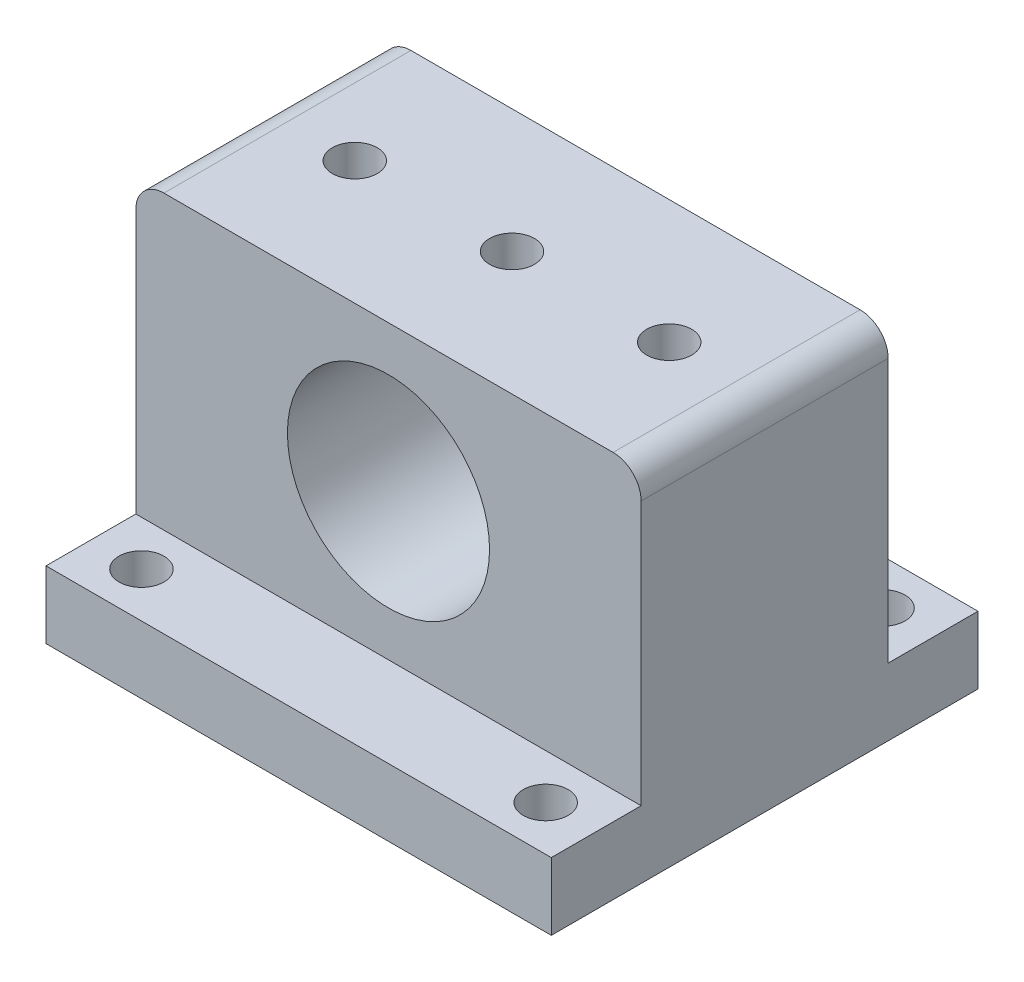
ISO-10303-21;
HEADER;
FILE_DESCRIPTION(('STEP AP214'),'2;1');
FILE_NAME('part.step','',(''),(''),'','','');
FILE_SCHEMA(('AUTOMOTIVE_DESIGN { 1 0 10303 214 1 1 1 1 }'));
ENDSEC;
DATA;
#1=APPLICATION_CONTEXT('core data for automotive mechanical design processes');
#2=APPLICATION_PROTOCOL_DEFINITION('international standard','automotive_design',2000,#1);
#3=PRODUCT_CONTEXT('',#1,'mechanical');
#4=PRODUCT('Part','Part','',(#3));
#5=PRODUCT_RELATED_PRODUCT_CATEGORY('part','',(#4));
#6=PRODUCT_DEFINITION_FORMATION('','',#4);
#7=PRODUCT_DEFINITION_CONTEXT('part definition',#1,'design');
#8=PRODUCT_DEFINITION('design','',#6,#7);
#9=PRODUCT_DEFINITION_SHAPE('','',#8);
#10=(LENGTH_UNIT() NAMED_UNIT(*) SI_UNIT(.MILLI.,.METRE.));
#11=(NAMED_UNIT(*) PLANE_ANGLE_UNIT() SI_UNIT($,.RADIAN.));
#12=(NAMED_UNIT(*) SI_UNIT($,.STERADIAN.) SOLID_ANGLE_UNIT());
#13=UNCERTAINTY_MEASURE_WITH_UNIT(LENGTH_MEASURE(1.E-05),#10,'distance_accuracy_value','');
#14=(GEOMETRIC_REPRESENTATION_CONTEXT(3) GLOBAL_UNCERTAINTY_ASSIGNED_CONTEXT((#13)) GLOBAL_UNIT_ASSIGNED_CONTEXT((#10,
#11,#12)) REPRESENTATION_CONTEXT('',''));
#15=CARTESIAN_POINT('',(0.,0.,0.));
#16=DIRECTION('',(0.,0.,1.));
#17=DIRECTION('',(1.,0.,0.));
#18=AXIS2_PLACEMENT_3D('',#15,#16,#17);
#19=CARTESIAN_POINT('',(0.,13.,11.));
#20=DIRECTION('',(0.,1.,0.));
#21=DIRECTION('',(0.,0.,1.));
#22=AXIS2_PLACEMENT_3D('',#19,#20,#21);
#23=PLANE('',#22);
#24=CARTESIAN_POINT('',(14.,13.,0.));
#25=DIRECTION('',(0.,-1.,0.));
#26=DIRECTION('',(0.,0.,1.));
#27=AXIS2_PLACEMENT_3D('',#24,#25,#26);
#28=CIRCLE('',#27,2.);
#29=CARTESIAN_POINT('',(14.,13.,2.));
#30=VERTEX_POINT('',#29);
#31=EDGE_CURVE('E358',#30,#30,#28,.T.);
#32=ORIENTED_EDGE('',*,*,#31,.T.);
#33=EDGE_LOOP('',(#32));
#34=FACE_BOUND('',#33,.T.);
#35=CARTESIAN_POINT('',(-14.,13.,0.));
#36=DIRECTION('',(0.,1.,0.));
#37=DIRECTION('',(0.,0.,1.));
#38=AXIS2_PLACEMENT_3D('',#35,#36,#37);
#39=CIRCLE('',#38,2.);
#40=CARTESIAN_POINT('',(-14.,13.,2.));
#41=VERTEX_POINT('',#40);
#42=EDGE_CURVE('E226',#41,#41,#39,.T.);
#43=ORIENTED_EDGE('',*,*,#42,.F.);
#44=EDGE_LOOP('',(#43));
#45=FACE_BOUND('',#44,.T.);
#46=CARTESIAN_POINT('',(0.,13.,0.));
#47=DIRECTION('',(0.,1.,0.));
#48=DIRECTION('',(0.,0.,1.));
#49=AXIS2_PLACEMENT_3D('',#46,#47,#48);
#50=CIRCLE('',#49,2.);
#51=CARTESIAN_POINT('',(0.,13.,2.));
#52=VERTEX_POINT('',#51);
#53=EDGE_CURVE('E224',#52,#52,#50,.T.);
#54=ORIENTED_EDGE('',*,*,#53,.F.);
#55=EDGE_LOOP('',(#54));
#56=FACE_BOUND('',#55,.T.);
#57=DIRECTION('',(1.,0.,0.));
#58=VECTOR('',#57,1.);
#59=CARTESIAN_POINT('',(0.,13.,-11.));
#60=LINE('',#59,#58);
#61=CARTESIAN_POINT('',(-20.,13.,-11.));
#62=VERTEX_POINT('',#61);
#63=CARTESIAN_POINT('',(20.,13.,-11.));
#64=VERTEX_POINT('',#63);
#65=EDGE_CURVE('E126',#62,#64,#60,.T.);
#66=ORIENTED_EDGE('',*,*,#65,.F.);
#67=DIRECTION('',(0.,0.,-1.));
#68=VECTOR('',#67,1.);
#69=CARTESIAN_POINT('',(-20.,13.,11.));
#70=LINE('',#69,#68);
#71=CARTESIAN_POINT('',(-20.,13.,11.));
#72=VERTEX_POINT('',#71);
#73=EDGE_CURVE('E11',#72,#62,#70,.T.);
#74=ORIENTED_EDGE('',*,*,#73,.F.);
#75=DIRECTION('',(1.,0.,0.));
#76=VECTOR('',#75,1.);
#77=CARTESIAN_POINT('',(0.,13.,11.));
#78=LINE('',#77,#76);
#79=CARTESIAN_POINT('',(20.,13.,11.));
#80=VERTEX_POINT('',#79);
#81=EDGE_CURVE('E286',#72,#80,#78,.T.);
#82=ORIENTED_EDGE('',*,*,#81,.T.);
#83=DIRECTION('',(0.,0.,-1.));
#84=VECTOR('',#83,1.);
#85=CARTESIAN_POINT('',(20.,13.,11.));
#86=LINE('',#85,#84);
#87=EDGE_CURVE('E58',#80,#64,#86,.T.);
#88=ORIENTED_EDGE('',*,*,#87,.T.);
#89=EDGE_LOOP('',(#66,#74,#82,#88));
#90=FACE_BOUND('',#89,.T.);
#91=ADVANCED_FACE('F41',(#34,#45,#56,#90),#23,.T.);
#92=CARTESIAN_POINT('',(-20.,10.5,11.));
#93=DIRECTION('',(0.,0.,-1.));
#94=DIRECTION('',(-1.,0.,0.));
#95=AXIS2_PLACEMENT_3D('',#92,#93,#94);
#96=CYLINDRICAL_SURFACE('',#95,2.5);
#97=CARTESIAN_POINT('',(-20.,10.5,-11.));
#98=DIRECTION('',(0.,0.,1.));
#99=DIRECTION('',(1.,0.,0.));
#100=AXIS2_PLACEMENT_3D('',#97,#98,#99);
#101=CIRCLE('',#100,2.5);
#102=CARTESIAN_POINT('',(-22.5,10.5,-11.));
#103=VERTEX_POINT('',#102);
#104=EDGE_CURVE('E128',#62,#103,#101,.T.);
#105=ORIENTED_EDGE('',*,*,#104,.T.);
#106=DIRECTION('',(0.,0.,-1.));
#107=VECTOR('',#106,1.);
#108=CARTESIAN_POINT('',(-22.5,10.5,11.));
#109=LINE('',#108,#107);
#110=CARTESIAN_POINT('',(-22.5,10.5,11.));
#111=VERTEX_POINT('',#110);
#112=EDGE_CURVE('E50',#111,#103,#109,.T.);
#113=ORIENTED_EDGE('',*,*,#112,.F.);
#114=CARTESIAN_POINT('',(-20.,10.5,11.));
#115=DIRECTION('',(0.,0.,1.));
#116=DIRECTION('',(1.,0.,0.));
#117=AXIS2_PLACEMENT_3D('',#114,#115,#116);
#118=CIRCLE('',#117,2.5);
#119=EDGE_CURVE('E288',#72,#111,#118,.T.);
#120=ORIENTED_EDGE('',*,*,#119,.F.);
#121=ORIENTED_EDGE('',*,*,#73,.T.);
#122=EDGE_LOOP('',(#105,#113,#120,#121));
#123=FACE_BOUND('',#122,.T.);
#124=ADVANCED_FACE('F153',(#123),#96,.T.);
#125=CARTESIAN_POINT('',(-22.5,0.,11.));
#126=DIRECTION('',(1.,0.,0.));
#127=DIRECTION('',(0.,1.,0.));
#128=AXIS2_PLACEMENT_3D('',#125,#126,#127);
#129=PLANE('',#128);
#130=DIRECTION('',(0.,-1.,0.));
#131=VECTOR('',#130,1.);
#132=CARTESIAN_POINT('',(-22.5,0.,-11.));
#133=LINE('',#132,#131);
#134=CARTESIAN_POINT('',(-22.5,-13.,-11.));
#135=VERTEX_POINT('',#134);
#136=EDGE_CURVE('E131',#103,#135,#133,.T.);
#137=ORIENTED_EDGE('',*,*,#136,.T.);
#138=DIRECTION('',(0.,0.,-1.));
#139=VECTOR('',#138,1.);
#140=CARTESIAN_POINT('',(-22.5,-13.,19.));
#141=LINE('',#140,#139);
#142=CARTESIAN_POINT('',(-22.5,-13.,-19.));
#143=VERTEX_POINT('',#142);
#144=EDGE_CURVE('E279',#135,#143,#141,.T.);
#145=ORIENTED_EDGE('',*,*,#144,.T.);
#146=DIRECTION('',(0.,1.,0.));
#147=VECTOR('',#146,1.);
#148=CARTESIAN_POINT('',(-22.5,0.,-19.));
#149=LINE('',#148,#147);
#150=CARTESIAN_POINT('',(-22.5,-19.,-19.));
#151=VERTEX_POINT('',#150);
#152=EDGE_CURVE('E259',#151,#143,#149,.T.);
#153=ORIENTED_EDGE('',*,*,#152,.F.);
#154=DIRECTION('',(0.,0.,-1.));
#155=VECTOR('',#154,1.);
#156=CARTESIAN_POINT('',(-22.5,-19.,19.));
#157=LINE('',#156,#155);
#158=CARTESIAN_POINT('',(-22.5,-19.,19.));
#159=VERTEX_POINT('',#158);
#160=EDGE_CURVE('E266',#159,#151,#157,.T.);
#161=ORIENTED_EDGE('',*,*,#160,.F.);
#162=DIRECTION('',(0.,1.,0.));
#163=VECTOR('',#162,1.);
#164=CARTESIAN_POINT('',(-22.5,0.,19.));
#165=LINE('',#164,#163);
#166=CARTESIAN_POINT('',(-22.5,-13.,19.));
#167=VERTEX_POINT('',#166);
#168=EDGE_CURVE('E263',#159,#167,#165,.T.);
#169=ORIENTED_EDGE('',*,*,#168,.T.);
#170=CARTESIAN_POINT('',(-22.5,-13.,11.));
#171=VERTEX_POINT('',#170);
#172=EDGE_CURVE('E280',#167,#171,#141,.T.);
#173=ORIENTED_EDGE('',*,*,#172,.T.);
#174=DIRECTION('',(0.,-1.,0.));
#175=VECTOR('',#174,1.);
#176=CARTESIAN_POINT('',(-22.5,0.,11.));
#177=LINE('',#176,#175);
#178=EDGE_CURVE('E115',#111,#171,#177,.T.);
#179=ORIENTED_EDGE('',*,*,#178,.F.);
#180=ORIENTED_EDGE('',*,*,#112,.T.);
#181=EDGE_LOOP('',(#137,#145,#153,#161,#169,#173,#179,#180));
#182=FACE_BOUND('',#181,.T.);
#183=ADVANCED_FACE('F148',(#182),#129,.F.);
#184=CARTESIAN_POINT('',(22.5,0.,11.));
#185=DIRECTION('',(1.,0.,0.));
#186=DIRECTION('',(0.,1.,0.));
#187=AXIS2_PLACEMENT_3D('',#184,#185,#186);
#188=PLANE('',#187);
#189=DIRECTION('',(0.,-1.,0.));
#190=VECTOR('',#189,1.);
#191=CARTESIAN_POINT('',(22.5,0.,-11.));
#192=LINE('',#191,#190);
#193=CARTESIAN_POINT('',(22.5,10.5,-11.));
#194=VERTEX_POINT('',#193);
#195=CARTESIAN_POINT('',(22.5,-13.,-11.));
#196=VERTEX_POINT('',#195);
#197=EDGE_CURVE('E137',#194,#196,#192,.T.);
#198=ORIENTED_EDGE('',*,*,#197,.F.);
#199=DIRECTION('',(0.,0.,-1.));
#200=VECTOR('',#199,1.);
#201=CARTESIAN_POINT('',(22.5,10.5,11.));
#202=LINE('',#201,#200);
#203=CARTESIAN_POINT('',(22.5,10.5,11.));
#204=VERTEX_POINT('',#203);
#205=EDGE_CURVE('E72',#204,#194,#202,.T.);
#206=ORIENTED_EDGE('',*,*,#205,.F.);
#207=DIRECTION('',(0.,-1.,0.));
#208=VECTOR('',#207,1.);
#209=CARTESIAN_POINT('',(22.5,0.,11.));
#210=LINE('',#209,#208);
#211=CARTESIAN_POINT('',(22.5,-13.,11.));
#212=VERTEX_POINT('',#211);
#213=EDGE_CURVE('E113',#204,#212,#210,.T.);
#214=ORIENTED_EDGE('',*,*,#213,.T.);
#215=DIRECTION('',(0.,0.,-1.));
#216=VECTOR('',#215,1.);
#217=CARTESIAN_POINT('',(22.5,-13.,19.));
#218=LINE('',#217,#216);
#219=CARTESIAN_POINT('',(22.5,-13.,19.));
#220=VERTEX_POINT('',#219);
#221=EDGE_CURVE('E91',#220,#212,#218,.T.);
#222=ORIENTED_EDGE('',*,*,#221,.F.);
#223=DIRECTION('',(0.,1.,0.));
#224=VECTOR('',#223,1.);
#225=CARTESIAN_POINT('',(22.5,0.,19.));
#226=LINE('',#225,#224);
#227=CARTESIAN_POINT('',(22.5,-19.,19.));
#228=VERTEX_POINT('',#227);
#229=EDGE_CURVE('E258',#228,#220,#226,.T.);
#230=ORIENTED_EDGE('',*,*,#229,.F.);
#231=DIRECTION('',(0.,0.,-1.));
#232=VECTOR('',#231,1.);
#233=CARTESIAN_POINT('',(22.5,-19.,19.));
#234=LINE('',#233,#232);
#235=CARTESIAN_POINT('',(22.5,-19.,-19.));
#236=VERTEX_POINT('',#235);
#237=EDGE_CURVE('E104',#228,#236,#234,.T.);
#238=ORIENTED_EDGE('',*,*,#237,.T.);
#239=DIRECTION('',(0.,1.,0.));
#240=VECTOR('',#239,1.);
#241=CARTESIAN_POINT('',(22.5,0.,-19.));
#242=LINE('',#241,#240);
#243=CARTESIAN_POINT('',(22.5,-13.,-19.));
#244=VERTEX_POINT('',#243);
#245=EDGE_CURVE('E269',#236,#244,#242,.T.);
#246=ORIENTED_EDGE('',*,*,#245,.T.);
#247=EDGE_CURVE('E105',#196,#244,#218,.T.);
#248=ORIENTED_EDGE('',*,*,#247,.F.);
#249=EDGE_LOOP('',(#198,#206,#214,#222,#230,#238,#246,#248));
#250=FACE_BOUND('',#249,.T.);
#251=ADVANCED_FACE('F117',(#250),#188,.T.);
#252=CARTESIAN_POINT('',(0.,0.,11.));
#253=DIRECTION('',(0.,0.,-1.));
#254=DIRECTION('',(-1.,0.,0.));
#255=AXIS2_PLACEMENT_3D('',#252,#253,#254);
#256=CYLINDRICAL_SURFACE('',#255,9.);
#257=CARTESIAN_POINT('',(0.,9.,2.));
#258=CARTESIAN_POINT('',(0.110880476775648,8.99999796218252,1.99999627632018));
#259=CARTESIAN_POINT('',(0.22180556526962,8.99793013995692,1.99074801833651));
#260=CARTESIAN_POINT('',(0.440501944103134,8.98988097757669,1.95403952764944));
#261=CARTESIAN_POINT('',(0.548270975138988,8.98389690217348,1.92656656599072));
#262=CARTESIAN_POINT('',(0.757463277761529,8.96868113169008,1.85431402950835));
#263=CARTESIAN_POINT('',(0.858893152100285,8.95945288439082,1.80955282300213));
#264=CARTESIAN_POINT('',(1.05280018031376,8.93874335441377,1.7040533875276));
#265=CARTESIAN_POINT('',(1.14527750793335,8.92726211547358,1.64331546870938));
#266=CARTESIAN_POINT('',(1.32018631401403,8.9030909417421,1.50652433489332));
#267=CARTESIAN_POINT('',(1.40244861204353,8.89038561641427,1.43025749786486));
#268=CARTESIAN_POINT('',(1.55312491045837,8.86530601079787,1.26503193990686));
#269=CARTESIAN_POINT('',(1.62153764410855,8.85293176088049,1.17607205928954));
#270=CARTESIAN_POINT('',(1.7433244341035,8.82976328261711,0.9867281559417));
#271=CARTESIAN_POINT('',(1.79651742104404,8.81898875742981,0.886225041958469));
#272=CARTESIAN_POINT('',(1.88519298954508,8.80046096352395,0.677427238307578));
#273=CARTESIAN_POINT('',(1.92067776220096,8.79270732104771,0.569133514495745));
#274=CARTESIAN_POINT('',(1.97236858006404,8.78125609459188,0.349666522677334));
#275=CARTESIAN_POINT('',(1.98887467038069,8.77749545807783,0.238567284894573));
#276=CARTESIAN_POINT('',(2.00307270997673,8.77426673730669,0.0151177822137991));
#277=CARTESIAN_POINT('',(2.00076704911663,8.77479810778939,-0.0972323219621479));
#278=CARTESIAN_POINT('',(1.97764827517302,8.78003632148145,-0.317756627193803));
#279=CARTESIAN_POINT('',(1.95718464460217,8.78466431384841,-0.425969624139346));
#280=CARTESIAN_POINT('',(1.89888490681146,8.79744954191675,-0.637387143325003));
#281=CARTESIAN_POINT('',(1.86104779681652,8.80560698133176,-0.7405913760854));
#282=CARTESIAN_POINT('',(1.76875672872875,8.82460909970296,-0.940039438381882));
#283=CARTESIAN_POINT('',(1.71416919379353,8.83547524362489,-1.03621932733607));
#284=CARTESIAN_POINT('',(1.5900206813985,8.85865737910743,-1.21818287051589));
#285=CARTESIAN_POINT('',(1.52045760074274,8.87097357420597,-1.30396506182015));
#286=CARTESIAN_POINT('',(1.36648683702983,8.89600574612666,-1.46470930934847));
#287=CARTESIAN_POINT('',(1.28178220526623,8.90872450687872,-1.53938678510506));
#288=CARTESIAN_POINT('',(1.10090661809162,8.93287839122317,-1.67352372890712));
#289=CARTESIAN_POINT('',(1.00473544183737,8.94431349008427,-1.7329829037819));
#290=CARTESIAN_POINT('',(0.803303190734734,8.96465064233607,-1.83506927577681));
#291=CARTESIAN_POINT('',(0.698022122319853,8.97354693007659,-1.87765824430826));
#292=CARTESIAN_POINT('',(0.481555930981456,8.98776136366255,-1.94446101305787));
#293=CARTESIAN_POINT('',(0.370371697593365,8.99308004696785,-1.96867757341413));
#294=CARTESIAN_POINT('',(0.147695483280844,8.99946317761672,-1.99763201325517));
#295=CARTESIAN_POINT('',(0.0362563973189045,9.00061248622289,-2.00275850016168));
#296=CARTESIAN_POINT('',(-0.18588592392808,8.99876558650597,-1.99444189573963));
#297=CARTESIAN_POINT('',(-0.296589210270646,8.9957696689046,-1.98100010668055));
#298=CARTESIAN_POINT('',(-0.512823257329422,8.98602258758613,-1.9362505848319));
#299=CARTESIAN_POINT('',(-0.618398491715484,8.97931447007761,-1.90514754377655));
#300=CARTESIAN_POINT('',(-0.822832805855832,8.96289421086795,-1.82618631255492));
#301=CARTESIAN_POINT('',(-0.921691300010178,8.95318180764659,-1.77832666369399));
#302=CARTESIAN_POINT('',(-1.11148643989438,8.93162153227639,-1.66640712320101));
#303=CARTESIAN_POINT('',(-1.20228573083225,8.91974444590247,-1.60212005699384));
#304=CARTESIAN_POINT('',(-1.37194696498812,8.8952303234908,-1.45946875089856));
#305=CARTESIAN_POINT('',(-1.45080730173413,8.88259318550175,-1.3811026196679));
#306=CARTESIAN_POINT('',(-1.59589548190985,8.8576887894581,-1.2107319664193));
#307=CARTESIAN_POINT('',(-1.66185381940073,8.84543317664284,-1.1184959099934));
#308=CARTESIAN_POINT('',(-1.77734611922752,8.82295395378308,-0.924027965589186));
#309=CARTESIAN_POINT('',(-1.82688079926974,8.8127302549527,-0.821796514657904));
#310=CARTESIAN_POINT('',(-1.90778001896259,8.79557200548926,-0.610791710894864));
#311=CARTESIAN_POINT('',(-1.93924786354759,8.78861879659786,-0.502059557731162));
#312=CARTESIAN_POINT('',(-1.98342027658406,8.77875649697392,-0.280675815137527));
#313=CARTESIAN_POINT('',(-1.99612795718356,8.77584673547331,-0.168024878974045));
#314=CARTESIAN_POINT('',(-2.00228356641044,8.77444401448977,0.0552788782783288));
#315=CARTESIAN_POINT('',(-1.99615913143933,8.77585298370124,0.165919508060061));
#316=CARTESIAN_POINT('',(-1.96578277121688,8.78270664957547,0.38454970996682));
#317=CARTESIAN_POINT('',(-1.94153107400239,8.78815129547033,0.492539315423484));
#318=CARTESIAN_POINT('',(-1.87579819980744,8.80241428131525,0.702449120227379));
#319=CARTESIAN_POINT('',(-1.83438116628454,8.81122005182769,0.804390316881596));
#320=CARTESIAN_POINT('',(-1.73554770348342,8.83121764469058,0.999939992546728));
#321=CARTESIAN_POINT('',(-1.67812954585193,8.84240972476633,1.09354756996401));
#322=CARTESIAN_POINT('',(-1.54751358990558,8.86621042835329,1.27187660894797));
#323=CARTESIAN_POINT('',(-1.47401185511038,8.8788437136774,1.35637220492265));
#324=CARTESIAN_POINT('',(-1.31392870594504,8.90393974173387,1.51197007393133));
#325=CARTESIAN_POINT('',(-1.22734426623343,8.91640244429053,1.58306924050841));
#326=CARTESIAN_POINT('',(-1.04214597064557,8.93995259726581,1.71077598291992));
#327=CARTESIAN_POINT('',(-0.943385636634948,8.95101923499228,1.76717519973493));
#328=CARTESIAN_POINT('',(-0.737560279778818,8.97032058369249,1.86248330418121));
#329=CARTESIAN_POINT('',(-0.630502203312995,8.97855763270815,1.90140664004617));
#330=CARTESIAN_POINT('',(-0.436138247729409,8.98982812909554,1.95384135027679));
#331=CARTESIAN_POINT('',(-0.349871991901681,8.9936186902321,1.97111737366629));
#332=CARTESIAN_POINT('',(-0.175746449894528,8.99870537459789,1.99419790430615));
#333=CARTESIAN_POINT('',(-0.087887238892878,9.00000161523613,2.0000029515019));
#334=CARTESIAN_POINT('',(0.,9.,2.));
#335=B_SPLINE_CURVE_WITH_KNOTS('',3,(#257,#258,#259,#260,#261,#262,#263,#264,#265,#266,#267,
#268,#269,#270,#271,#272,#273,#274,#275,#276,#277,#278,#279,#280,#281,#282,#283,#284,#285,#286,
#287,#288,#289,#290,#291,#292,#293,#294,#295,#296,#297,#298,#299,#300,#301,#302,#303,#304,#305,
#306,#307,#308,#309,#310,#311,#312,#313,#314,#315,#316,#317,#318,#319,#320,#321,#322,#323,#324,
#325,#326,#327,#328,#329,#330,#331,#332,#333,#334),.UNSPECIFIED.,.T.,.F.,(4,2,2,2,2,2,2,2,2,2,2,
2,2,2,2,2,2,2,2,2,2,2,2,2,2,2,2,2,2,2,2,2,2,2,2,2,2,2,4),(0.,0.332319689729797,
0.664871731249283,0.997071412407459,1.32926464516989,1.66638072002079,2.00352761490514,
2.34453296297976,2.6854961068774,3.02099125638107,3.35644378496591,3.68557668145784,
4.0147285774694,4.34657669709581,4.678471452583,5.01778179808977,5.35709867969827,
5.69718012811237,6.03721047501988,6.37027992124269,6.70332600912267,7.03258869425167,
7.36188004945459,7.69599803262041,8.03016093387756,8.37069473105728,8.71121364510411,
9.04976559055243,9.38826136686411,9.71912785142416,10.0499901738286,10.3796271201578,
10.7092996858639,11.0458432631282,11.3824647846641,11.7236258704957,12.0645043787094,
12.3279234735856,12.5913301688795),.UNSPECIFIED.);
#336=CARTESIAN_POINT('',(0.,9.,2.));
#337=VERTEX_POINT('',#336);
#338=EDGE_CURVE('E217',#337,#337,#335,.T.);
#339=ORIENTED_EDGE('',*,*,#338,.T.);
#340=EDGE_LOOP('',(#339));
#341=FACE_BOUND('',#340,.T.);
#342=CARTESIAN_POINT('',(0.,0.,11.));
#343=DIRECTION('',(0.,0.,1.));
#344=DIRECTION('',(1.,0.,0.));
#345=AXIS2_PLACEMENT_3D('',#342,#343,#344);
#346=CIRCLE('',#345,9.);
#347=CARTESIAN_POINT('',(9.,0.,11.));
#348=VERTEX_POINT('',#347);
#349=EDGE_CURVE('E143',#348,#348,#346,.T.);
#350=ORIENTED_EDGE('',*,*,#349,.T.);
#351=EDGE_LOOP('',(#350));
#352=FACE_BOUND('',#351,.T.);
#353=CARTESIAN_POINT('',(0.,0.,-11.));
#354=DIRECTION('',(0.,0.,1.));
#355=DIRECTION('',(1.,0.,0.));
#356=AXIS2_PLACEMENT_3D('',#353,#354,#355);
#357=CIRCLE('',#356,9.);
#358=CARTESIAN_POINT('',(9.,0.,-11.));
#359=VERTEX_POINT('',#358);
#360=EDGE_CURVE('E123',#359,#359,#357,.T.);
#361=ORIENTED_EDGE('',*,*,#360,.F.);
#362=EDGE_LOOP('',(#361));
#363=FACE_BOUND('',#362,.T.);
#364=ADVANCED_FACE('F43',(#341,#352,#363),#256,.F.);
#365=CARTESIAN_POINT('',(20.,10.5,11.));
#366=DIRECTION('',(0.,0.,-1.));
#367=DIRECTION('',(-1.,0.,0.));
#368=AXIS2_PLACEMENT_3D('',#365,#366,#367);
#369=CYLINDRICAL_SURFACE('',#368,2.5);
#370=CARTESIAN_POINT('',(20.,10.5,-11.));
#371=DIRECTION('',(0.,0.,1.));
#372=DIRECTION('',(1.,0.,0.));
#373=AXIS2_PLACEMENT_3D('',#370,#371,#372);
#374=CIRCLE('',#373,2.5);
#375=EDGE_CURVE('E140',#64,#194,#374,.F.);
#376=ORIENTED_EDGE('',*,*,#375,.F.);
#377=ORIENTED_EDGE('',*,*,#87,.F.);
#378=CARTESIAN_POINT('',(20.,10.5,11.));
#379=DIRECTION('',(0.,0.,1.));
#380=DIRECTION('',(1.,0.,0.));
#381=AXIS2_PLACEMENT_3D('',#378,#379,#380);
#382=CIRCLE('',#381,2.5);
#383=EDGE_CURVE('E118',#80,#204,#382,.F.);
#384=ORIENTED_EDGE('',*,*,#383,.T.);
#385=ORIENTED_EDGE('',*,*,#205,.T.);
#386=EDGE_LOOP('',(#376,#377,#384,#385));
#387=FACE_BOUND('',#386,.T.);
#388=ADVANCED_FACE('F170',(#387),#369,.T.);
#389=CARTESIAN_POINT('',(0.,0.,11.));
#390=DIRECTION('',(0.,0.,1.));
#391=DIRECTION('',(1.,0.,0.));
#392=AXIS2_PLACEMENT_3D('',#389,#390,#391);
#393=PLANE('',#392);
#394=ORIENTED_EDGE('',*,*,#349,.F.);
#395=EDGE_LOOP('',(#394));
#396=FACE_BOUND('',#395,.T.);
#397=ORIENTED_EDGE('',*,*,#81,.F.);
#398=ORIENTED_EDGE('',*,*,#119,.T.);
#399=ORIENTED_EDGE('',*,*,#178,.T.);
#400=DIRECTION('',(1.,0.,0.));
#401=VECTOR('',#400,1.);
#402=CARTESIAN_POINT('',(0.,-13.,11.));
#403=LINE('',#402,#401);
#404=EDGE_CURVE('E96',#171,#212,#403,.T.);
#405=ORIENTED_EDGE('',*,*,#404,.T.);
#406=ORIENTED_EDGE('',*,*,#213,.F.);
#407=ORIENTED_EDGE('',*,*,#383,.F.);
#408=EDGE_LOOP('',(#397,#398,#399,#405,#406,#407));
#409=FACE_BOUND('',#408,.T.);
#410=ADVANCED_FACE('F111',(#396,#409),#393,.T.);
#411=CARTESIAN_POINT('',(0.,0.,-11.));
#412=DIRECTION('',(0.,0.,1.));
#413=DIRECTION('',(1.,0.,0.));
#414=AXIS2_PLACEMENT_3D('',#411,#412,#413);
#415=PLANE('',#414);
#416=ORIENTED_EDGE('',*,*,#360,.T.);
#417=EDGE_LOOP('',(#416));
#418=FACE_BOUND('',#417,.T.);
#419=ORIENTED_EDGE('',*,*,#65,.T.);
#420=ORIENTED_EDGE('',*,*,#375,.T.);
#421=ORIENTED_EDGE('',*,*,#197,.T.);
#422=DIRECTION('',(1.,0.,0.));
#423=VECTOR('',#422,1.);
#424=CARTESIAN_POINT('',(0.,-13.,-11.));
#425=LINE('',#424,#423);
#426=EDGE_CURVE('E134',#135,#196,#425,.T.);
#427=ORIENTED_EDGE('',*,*,#426,.F.);
#428=ORIENTED_EDGE('',*,*,#136,.F.);
#429=ORIENTED_EDGE('',*,*,#104,.F.);
#430=EDGE_LOOP('',(#419,#420,#421,#427,#428,#429));
#431=FACE_BOUND('',#430,.T.);
#432=ADVANCED_FACE('F155',(#418,#431),#415,.F.);
#433=CARTESIAN_POINT('',(0.,-13.,19.));
#434=DIRECTION('',(0.,1.,0.));
#435=DIRECTION('',(0.,0.,1.));
#436=AXIS2_PLACEMENT_3D('',#433,#434,#435);
#437=PLANE('',#436);
#438=CARTESIAN_POINT('',(18.,-13.,15.));
#439=DIRECTION('',(0.,1.,0.));
#440=DIRECTION('',(0.,0.,-1.));
#441=AXIS2_PLACEMENT_3D('',#438,#439,#440);
#442=CIRCLE('',#441,2.);
#443=CARTESIAN_POINT('',(18.,-13.,13.));
#444=VERTEX_POINT('',#443);
#445=EDGE_CURVE('E235',#444,#444,#442,.T.);
#446=ORIENTED_EDGE('',*,*,#445,.F.);
#447=EDGE_LOOP('',(#446));
#448=FACE_BOUND('',#447,.T.);
#449=CARTESIAN_POINT('',(-18.,-13.,15.));
#450=DIRECTION('',(0.,1.,0.));
#451=DIRECTION('',(0.,0.,1.));
#452=AXIS2_PLACEMENT_3D('',#449,#450,#451);
#453=CIRCLE('',#452,2.);
#454=CARTESIAN_POINT('',(-18.,-13.,17.));
#455=VERTEX_POINT('',#454);
#456=EDGE_CURVE('E234',#455,#455,#453,.T.);
#457=ORIENTED_EDGE('',*,*,#456,.F.);
#458=EDGE_LOOP('',(#457));
#459=FACE_BOUND('',#458,.T.);
#460=ORIENTED_EDGE('',*,*,#404,.F.);
#461=ORIENTED_EDGE('',*,*,#172,.F.);
#462=DIRECTION('',(1.,0.,0.));
#463=VECTOR('',#462,1.);
#464=CARTESIAN_POINT('',(0.,-13.,19.));
#465=LINE('',#464,#463);
#466=EDGE_CURVE('E100',#167,#220,#465,.T.);
#467=ORIENTED_EDGE('',*,*,#466,.T.);
#468=ORIENTED_EDGE('',*,*,#221,.T.);
#469=EDGE_LOOP('',(#460,#461,#467,#468));
#470=FACE_BOUND('',#469,.T.);
#471=ADVANCED_FACE('F93',(#448,#459,#470),#437,.T.);
#472=CARTESIAN_POINT('',(0.,-19.,19.));
#473=DIRECTION('',(0.,1.,0.));
#474=DIRECTION('',(0.,0.,1.));
#475=AXIS2_PLACEMENT_3D('',#472,#473,#474);
#476=PLANE('',#475);
#477=CARTESIAN_POINT('',(-18.,-19.,-15.));
#478=DIRECTION('',(0.,1.,0.));
#479=DIRECTION('',(0.,0.,-1.));
#480=AXIS2_PLACEMENT_3D('',#477,#478,#479);
#481=CIRCLE('',#480,2.);
#482=CARTESIAN_POINT('',(-18.,-19.,-17.));
#483=VERTEX_POINT('',#482);
#484=EDGE_CURVE('E244',#483,#483,#481,.T.);
#485=ORIENTED_EDGE('',*,*,#484,.T.);
#486=EDGE_LOOP('',(#485));
#487=FACE_BOUND('',#486,.T.);
#488=CARTESIAN_POINT('',(18.,-19.,-15.));
#489=DIRECTION('',(0.,1.,0.));
#490=DIRECTION('',(0.,0.,1.));
#491=AXIS2_PLACEMENT_3D('',#488,#489,#490);
#492=CIRCLE('',#491,2.);
#493=CARTESIAN_POINT('',(18.,-19.,-13.));
#494=VERTEX_POINT('',#493);
#495=EDGE_CURVE('E238',#494,#494,#492,.T.);
#496=ORIENTED_EDGE('',*,*,#495,.T.);
#497=EDGE_LOOP('',(#496));
#498=FACE_BOUND('',#497,.T.);
#499=CARTESIAN_POINT('',(18.,-19.,15.));
#500=DIRECTION('',(0.,1.,0.));
#501=DIRECTION('',(0.,0.,-1.));
#502=AXIS2_PLACEMENT_3D('',#499,#500,#501);
#503=CIRCLE('',#502,2.);
#504=CARTESIAN_POINT('',(18.,-19.,13.));
#505=VERTEX_POINT('',#504);
#506=EDGE_CURVE('E231',#505,#505,#503,.T.);
#507=ORIENTED_EDGE('',*,*,#506,.T.);
#508=EDGE_LOOP('',(#507));
#509=FACE_BOUND('',#508,.T.);
#510=CARTESIAN_POINT('',(-18.,-19.,15.));
#511=DIRECTION('',(0.,1.,0.));
#512=DIRECTION('',(0.,0.,1.));
#513=AXIS2_PLACEMENT_3D('',#510,#511,#512);
#514=CIRCLE('',#513,2.);
#515=CARTESIAN_POINT('',(-18.,-19.,17.));
#516=VERTEX_POINT('',#515);
#517=EDGE_CURVE('E249',#516,#516,#514,.T.);
#518=ORIENTED_EDGE('',*,*,#517,.T.);
#519=EDGE_LOOP('',(#518));
#520=FACE_BOUND('',#519,.T.);
#521=DIRECTION('',(1.,0.,0.));
#522=VECTOR('',#521,1.);
#523=CARTESIAN_POINT('',(0.,-19.,-19.));
#524=LINE('',#523,#522);
#525=EDGE_CURVE('E252',#151,#236,#524,.T.);
#526=ORIENTED_EDGE('',*,*,#525,.T.);
#527=ORIENTED_EDGE('',*,*,#237,.F.);
#528=DIRECTION('',(1.,0.,0.));
#529=VECTOR('',#528,1.);
#530=CARTESIAN_POINT('',(0.,-19.,19.));
#531=LINE('',#530,#529);
#532=EDGE_CURVE('E255',#159,#228,#531,.T.);
#533=ORIENTED_EDGE('',*,*,#532,.F.);
#534=ORIENTED_EDGE('',*,*,#160,.T.);
#535=EDGE_LOOP('',(#526,#527,#533,#534));
#536=FACE_BOUND('',#535,.T.);
#537=ADVANCED_FACE('F179',(#487,#498,#509,#520,#536),#476,.F.);
#538=CARTESIAN_POINT('',(-18.,-13.,-15.));
#539=DIRECTION('',(0.,1.,0.));
#540=DIRECTION('',(0.,0.,-1.));
#541=AXIS2_PLACEMENT_3D('',#538,#539,#540);
#542=CIRCLE('',#541,2.);
#543=CARTESIAN_POINT('',(-18.,-13.,-17.));
#544=VERTEX_POINT('',#543);
#545=EDGE_CURVE('E230',#544,#544,#542,.T.);
#546=ORIENTED_EDGE('',*,*,#545,.F.);
#547=EDGE_LOOP('',(#546));
#548=FACE_BOUND('',#547,.T.);
#549=CARTESIAN_POINT('',(18.,-13.,-15.));
#550=DIRECTION('',(0.,1.,0.));
#551=DIRECTION('',(0.,0.,1.));
#552=AXIS2_PLACEMENT_3D('',#549,#550,#551);
#553=CIRCLE('',#552,2.);
#554=CARTESIAN_POINT('',(18.,-13.,-13.));
#555=VERTEX_POINT('',#554);
#556=EDGE_CURVE('E241',#555,#555,#553,.T.);
#557=ORIENTED_EDGE('',*,*,#556,.F.);
#558=EDGE_LOOP('',(#557));
#559=FACE_BOUND('',#558,.T.);
#560=ORIENTED_EDGE('',*,*,#144,.F.);
#561=ORIENTED_EDGE('',*,*,#426,.T.);
#562=ORIENTED_EDGE('',*,*,#247,.T.);
#563=DIRECTION('',(1.,0.,0.));
#564=VECTOR('',#563,1.);
#565=CARTESIAN_POINT('',(0.,-13.,-19.));
#566=LINE('',#565,#564);
#567=EDGE_CURVE('E272',#143,#244,#566,.T.);
#568=ORIENTED_EDGE('',*,*,#567,.F.);
#569=EDGE_LOOP('',(#560,#561,#562,#568));
#570=FACE_BOUND('',#569,.T.);
#571=ADVANCED_FACE('F182',(#548,#559,#570),#437,.T.);
#572=CARTESIAN_POINT('',(0.,0.,19.));
#573=DIRECTION('',(0.,0.,1.));
#574=DIRECTION('',(1.,0.,0.));
#575=AXIS2_PLACEMENT_3D('',#572,#573,#574);
#576=PLANE('',#575);
#577=ORIENTED_EDGE('',*,*,#532,.T.);
#578=ORIENTED_EDGE('',*,*,#229,.T.);
#579=ORIENTED_EDGE('',*,*,#466,.F.);
#580=ORIENTED_EDGE('',*,*,#168,.F.);
#581=EDGE_LOOP('',(#577,#578,#579,#580));
#582=FACE_BOUND('',#581,.T.);
#583=ADVANCED_FACE('F186',(#582),#576,.T.);
#584=CARTESIAN_POINT('',(0.,0.,-19.));
#585=DIRECTION('',(0.,0.,1.));
#586=DIRECTION('',(1.,0.,0.));
#587=AXIS2_PLACEMENT_3D('',#584,#585,#586);
#588=PLANE('',#587);
#589=ORIENTED_EDGE('',*,*,#525,.F.);
#590=ORIENTED_EDGE('',*,*,#152,.T.);
#591=ORIENTED_EDGE('',*,*,#567,.T.);
#592=ORIENTED_EDGE('',*,*,#245,.F.);
#593=EDGE_LOOP('',(#589,#590,#591,#592));
#594=FACE_BOUND('',#593,.T.);
#595=ADVANCED_FACE('F188',(#594),#588,.F.);
#596=CARTESIAN_POINT('',(18.,-19.,-15.));
#597=DIRECTION('',(0.,1.,0.));
#598=DIRECTION('',(0.,0.,1.));
#599=AXIS2_PLACEMENT_3D('',#596,#597,#598);
#600=CYLINDRICAL_SURFACE('',#599,2.);
#601=ORIENTED_EDGE('',*,*,#495,.F.);
#602=EDGE_LOOP('',(#601));
#603=FACE_BOUND('',#602,.T.);
#604=ORIENTED_EDGE('',*,*,#556,.T.);
#605=EDGE_LOOP('',(#604));
#606=FACE_BOUND('',#605,.T.);
#607=ADVANCED_FACE('F191',(#603,#606),#600,.F.);
#608=CARTESIAN_POINT('',(-18.,-19.,-15.));
#609=DIRECTION('',(0.,1.,0.));
#610=DIRECTION('',(0.,0.,1.));
#611=AXIS2_PLACEMENT_3D('',#608,#609,#610);
#612=CYLINDRICAL_SURFACE('',#611,2.);
#613=ORIENTED_EDGE('',*,*,#484,.F.);
#614=EDGE_LOOP('',(#613));
#615=FACE_BOUND('',#614,.T.);
#616=ORIENTED_EDGE('',*,*,#545,.T.);
#617=EDGE_LOOP('',(#616));
#618=FACE_BOUND('',#617,.T.);
#619=ADVANCED_FACE('F200',(#615,#618),#612,.F.);
#620=CARTESIAN_POINT('',(-18.,-19.,15.));
#621=DIRECTION('',(0.,1.,0.));
#622=DIRECTION('',(0.,0.,1.));
#623=AXIS2_PLACEMENT_3D('',#620,#621,#622);
#624=CYLINDRICAL_SURFACE('',#623,2.);
#625=ORIENTED_EDGE('',*,*,#517,.F.);
#626=EDGE_LOOP('',(#625));
#627=FACE_BOUND('',#626,.T.);
#628=ORIENTED_EDGE('',*,*,#456,.T.);
#629=EDGE_LOOP('',(#628));
#630=FACE_BOUND('',#629,.T.);
#631=ADVANCED_FACE('F196',(#627,#630),#624,.F.);
#632=CARTESIAN_POINT('',(18.,-19.,15.));
#633=DIRECTION('',(0.,1.,0.));
#634=DIRECTION('',(0.,0.,1.));
#635=AXIS2_PLACEMENT_3D('',#632,#633,#634);
#636=CYLINDRICAL_SURFACE('',#635,2.);
#637=ORIENTED_EDGE('',*,*,#506,.F.);
#638=EDGE_LOOP('',(#637));
#639=FACE_BOUND('',#638,.T.);
#640=ORIENTED_EDGE('',*,*,#445,.T.);
#641=EDGE_LOOP('',(#640));
#642=FACE_BOUND('',#641,.T.);
#643=ADVANCED_FACE('F199',(#639,#642),#636,.F.);
#644=CARTESIAN_POINT('',(0.,-19.001,0.));
#645=DIRECTION('',(0.,1.,0.));
#646=DIRECTION('',(0.,0.,1.));
#647=AXIS2_PLACEMENT_3D('',#644,#645,#646);
#648=CYLINDRICAL_SURFACE('',#647,2.);
#649=ORIENTED_EDGE('',*,*,#338,.F.);
#650=EDGE_LOOP('',(#649));
#651=FACE_BOUND('',#650,.T.);
#652=ORIENTED_EDGE('',*,*,#53,.T.);
#653=EDGE_LOOP('',(#652));
#654=FACE_BOUND('',#653,.T.);
#655=ADVANCED_FACE('F210',(#651,#654),#648,.F.);
#656=CARTESIAN_POINT('',(-14.,-7.,0.));
#657=DIRECTION('',(0.,1.,0.));
#658=DIRECTION('',(0.,0.,1.));
#659=AXIS2_PLACEMENT_3D('',#656,#657,#658);
#660=CYLINDRICAL_SURFACE('',#659,2.);
#661=CARTESIAN_POINT('',(-14.,-7.,0.));
#662=DIRECTION('',(0.,1.,0.));
#663=DIRECTION('',(0.,0.,1.));
#664=AXIS2_PLACEMENT_3D('',#661,#662,#663);
#665=CIRCLE('',#664,2.);
#666=CARTESIAN_POINT('',(-14.,-7.,2.));
#667=VERTEX_POINT('',#666);
#668=EDGE_CURVE('E225',#667,#667,#665,.T.);
#669=ORIENTED_EDGE('',*,*,#668,.F.);
#670=EDGE_LOOP('',(#669));
#671=FACE_BOUND('',#670,.T.);
#672=ORIENTED_EDGE('',*,*,#42,.T.);
#673=EDGE_LOOP('',(#672));
#674=FACE_BOUND('',#673,.T.);
#675=ADVANCED_FACE('F330',(#671,#674),#660,.F.);
#676=CARTESIAN_POINT('',(0.,-7.,0.));
#677=DIRECTION('',(0.,1.,0.));
#678=DIRECTION('',(0.,0.,1.));
#679=AXIS2_PLACEMENT_3D('',#676,#677,#678);
#680=PLANE('',#679);
#681=ORIENTED_EDGE('',*,*,#668,.T.);
#682=EDGE_LOOP('',(#681));
#683=FACE_BOUND('',#682,.T.);
#684=ADVANCED_FACE('F336',(#683),#680,.T.);
#685=CARTESIAN_POINT('',(14.,-7.,0.));
#686=DIRECTION('',(0.,1.,0.));
#687=DIRECTION('',(0.,0.,1.));
#688=AXIS2_PLACEMENT_3D('',#685,#686,#687);
#689=CYLINDRICAL_SURFACE('',#688,2.);
#690=CARTESIAN_POINT('',(14.,-7.,0.));
#691=DIRECTION('',(0.,-1.,0.));
#692=DIRECTION('',(0.,0.,1.));
#693=AXIS2_PLACEMENT_3D('',#690,#691,#692);
#694=CIRCLE('',#693,2.);
#695=CARTESIAN_POINT('',(14.,-7.,2.));
#696=VERTEX_POINT('',#695);
#697=EDGE_CURVE('E357',#696,#696,#694,.T.);
#698=ORIENTED_EDGE('',*,*,#697,.T.);
#699=EDGE_LOOP('',(#698));
#700=FACE_BOUND('',#699,.T.);
#701=ORIENTED_EDGE('',*,*,#31,.F.);
#702=EDGE_LOOP('',(#701));
#703=FACE_BOUND('',#702,.T.);
#704=ADVANCED_FACE('F341',(#700,#703),#689,.F.);
#705=CARTESIAN_POINT('',(0.,-7.,0.));
#706=DIRECTION('',(0.,1.,0.));
#707=DIRECTION('',(0.,0.,1.));
#708=AXIS2_PLACEMENT_3D('',#705,#706,#707);
#709=PLANE('',#708);
#710=ORIENTED_EDGE('',*,*,#697,.F.);
#711=EDGE_LOOP('',(#710));
#712=FACE_BOUND('',#711,.T.);
#713=ADVANCED_FACE('F349',(#712),#709,.T.);
#714=CLOSED_SHELL('',(#91,#124,#183,#251,#364,#388,#410,#432,#471,#537,#571,#583,#595,#607,#619,
#631,#643,#655,#675,#684,#704,#713));
#715=MANIFOLD_SOLID_BREP('B2',#714);
#716=ADVANCED_BREP_SHAPE_REPRESENTATION('',(#18,#715),#14);
#717=SHAPE_DEFINITION_REPRESENTATION(#9,#716);
ENDSEC;
END-ISO-10303-21;
